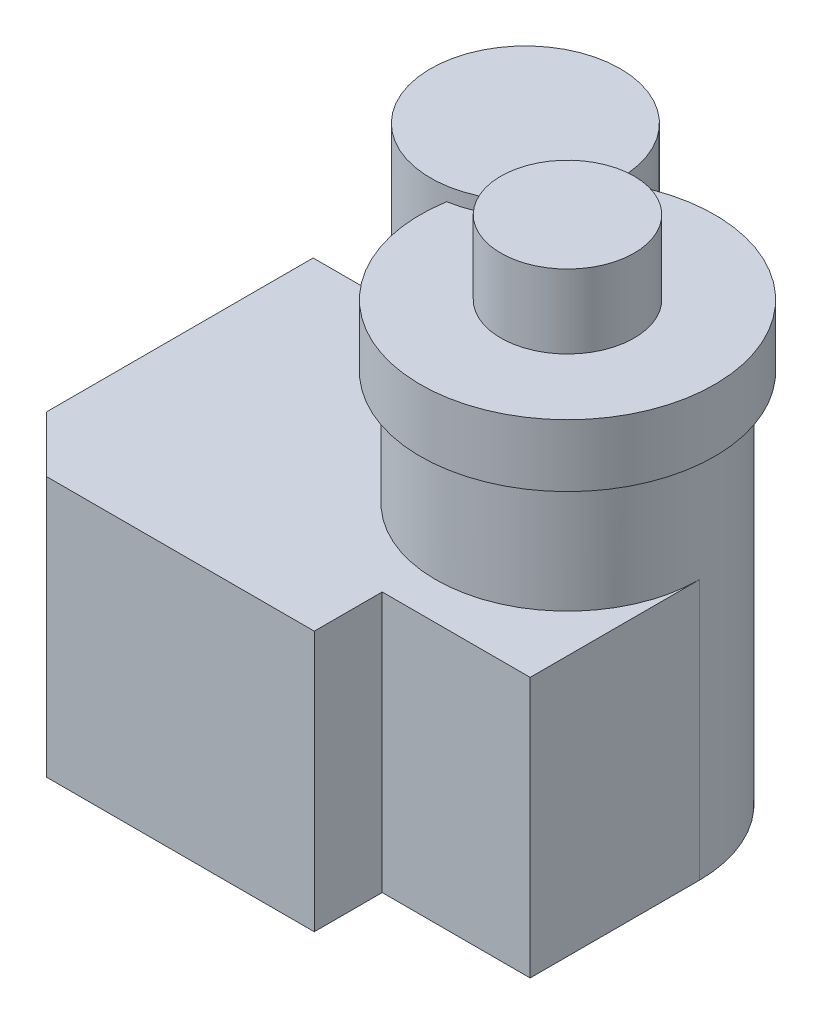
ISO-10303-21;
HEADER;
FILE_DESCRIPTION(('STEP AP214'),'2;1');
FILE_NAME('part.step','',(''),(''),'','','');
FILE_SCHEMA(('AUTOMOTIVE_DESIGN { 1 0 10303 214 1 1 1 1 }'));
ENDSEC;
DATA;
#1=APPLICATION_CONTEXT('core data for automotive mechanical design processes');
#2=APPLICATION_PROTOCOL_DEFINITION('international standard','automotive_design',2000,#1);
#3=PRODUCT_CONTEXT('',#1,'mechanical');
#4=PRODUCT('Part','Part','',(#3));
#5=PRODUCT_RELATED_PRODUCT_CATEGORY('part','',(#4));
#6=PRODUCT_DEFINITION_FORMATION('','',#4);
#7=PRODUCT_DEFINITION_CONTEXT('part definition',#1,'design');
#8=PRODUCT_DEFINITION('design','',#6,#7);
#9=PRODUCT_DEFINITION_SHAPE('','',#8);
#10=(LENGTH_UNIT() NAMED_UNIT(*) SI_UNIT(.MILLI.,.METRE.));
#11=(NAMED_UNIT(*) PLANE_ANGLE_UNIT() SI_UNIT($,.RADIAN.));
#12=(NAMED_UNIT(*) SI_UNIT($,.STERADIAN.) SOLID_ANGLE_UNIT());
#13=UNCERTAINTY_MEASURE_WITH_UNIT(LENGTH_MEASURE(1.E-05),#10,'distance_accuracy_value','');
#14=(GEOMETRIC_REPRESENTATION_CONTEXT(3) GLOBAL_UNCERTAINTY_ASSIGNED_CONTEXT((#13)) GLOBAL_UNIT_ASSIGNED_CONTEXT((#10,
#11,#12)) REPRESENTATION_CONTEXT('',''));
#15=CARTESIAN_POINT('',(0.,0.,0.));
#16=DIRECTION('',(0.,0.,1.));
#17=DIRECTION('',(1.,0.,0.));
#18=AXIS2_PLACEMENT_3D('',#15,#16,#17);
#19=CARTESIAN_POINT('',(0.,33.5999999999997,0.));
#20=DIRECTION('',(0.,1.,0.));
#21=DIRECTION('',(0.,0.,1.));
#22=AXIS2_PLACEMENT_3D('',#19,#20,#21);
#23=CONICAL_SURFACE('',#22,0.0140065580305215,0.61176630077576);
#24=CARTESIAN_POINT('',(0.,33.5800348749994,0.));
#25=VERTEX_POINT('',#24);
#26=VERTEX_LOOP('',#25);
#27=FACE_BOUND('',#26,.T.);
#28=CARTESIAN_POINT('',(0.,33.5999999999999,0.));
#29=DIRECTION('',(0.,1.,0.));
#30=DIRECTION('',(0.,0.,1.));
#31=AXIS2_PLACEMENT_3D('',#28,#29,#30);
#32=CIRCLE('',#31,0.0140065580305994);
#33=CARTESIAN_POINT('',(0.,33.5999999999999,0.0140065580305994));
#34=VERTEX_POINT('',#33);
#35=EDGE_CURVE('E19',#34,#34,#32,.F.);
#36=ORIENTED_EDGE('',*,*,#35,.F.);
#37=EDGE_LOOP('',(#36));
#38=FACE_BOUND('',#37,.T.);
#39=ADVANCED_FACE('F16',(#27,#38),#23,.F.);
#40=CARTESIAN_POINT('',(0.,33.6,0.));
#41=DIRECTION('',(0.,1.,0.));
#42=DIRECTION('',(0.,0.,1.));
#43=AXIS2_PLACEMENT_3D('',#40,#41,#42);
#44=PLANE('',#43);
#45=ORIENTED_EDGE('',*,*,#35,.T.);
#46=EDGE_LOOP('',(#45));
#47=FACE_BOUND('',#46,.T.);
#48=CARTESIAN_POINT('',(0.,33.6,0.));
#49=DIRECTION('',(0.,-1.,0.));
#50=DIRECTION('',(0.,0.,-1.));
#51=AXIS2_PLACEMENT_3D('',#48,#49,#50);
#52=CIRCLE('',#51,5.89);
#53=CARTESIAN_POINT('',(0.,33.6,-5.89));
#54=VERTEX_POINT('',#53);
#55=EDGE_CURVE('E103',#54,#54,#52,.T.);
#56=ORIENTED_EDGE('',*,*,#55,.F.);
#57=EDGE_LOOP('',(#56));
#58=FACE_BOUND('',#57,.T.);
#59=ADVANCED_FACE('F99',(#47,#58),#44,.T.);
#60=CARTESIAN_POINT('',(0.,33.6,0.));
#61=DIRECTION('',(0.,-1.,0.));
#62=DIRECTION('',(0.,0.,-1.));
#63=AXIS2_PLACEMENT_3D('',#60,#61,#62);
#64=CYLINDRICAL_SURFACE('',#63,5.89);
#65=CARTESIAN_POINT('',(0.,27.1,0.));
#66=DIRECTION('',(0.,-1.,0.));
#67=DIRECTION('',(0.,0.,-1.));
#68=AXIS2_PLACEMENT_3D('',#65,#66,#67);
#69=CIRCLE('',#68,5.89);
#70=CARTESIAN_POINT('',(0.,27.1,-5.89));
#71=VERTEX_POINT('',#70);
#72=EDGE_CURVE('E112',#71,#71,#69,.T.);
#73=ORIENTED_EDGE('',*,*,#72,.F.);
#74=EDGE_LOOP('',(#73));
#75=FACE_BOUND('',#74,.T.);
#76=ORIENTED_EDGE('',*,*,#55,.T.);
#77=EDGE_LOOP('',(#76));
#78=FACE_BOUND('',#77,.T.);
#79=ADVANCED_FACE('F450',(#75,#78),#64,.T.);
#80=CARTESIAN_POINT('',(-51.7786558204881,21.6,4.66472217329458));
#81=DIRECTION('',(0.,1.,0.));
#82=DIRECTION('',(0.,0.,1.));
#83=AXIS2_PLACEMENT_3D('',#80,#81,#82);
#84=PLANE('',#83);
#85=CARTESIAN_POINT('',(-14.145,21.6,-10.425));
#86=DIRECTION('',(0.,-1.,0.));
#87=DIRECTION('',(0.,0.,-1.));
#88=AXIS2_PLACEMENT_3D('',#85,#86,#87);
#89=CIRCLE('',#88,8.375);
#90=CARTESIAN_POINT('',(-11.3737933056841,21.6,-2.52177037804297));
#91=VERTEX_POINT('',#90);
#92=CARTESIAN_POINT('',(-12.8200607682087,21.6,-2.15546790730815));
#93=VERTEX_POINT('',#92);
#94=EDGE_CURVE('E107',#91,#93,#89,.T.);
#95=ORIENTED_EDGE('',*,*,#94,.F.);
#96=CARTESIAN_POINT('',(0.,21.6,0.));
#97=DIRECTION('',(0.,-1.,0.));
#98=DIRECTION('',(0.,0.,-1.));
#99=AXIS2_PLACEMENT_3D('',#96,#97,#98);
#100=CIRCLE('',#99,11.65);
#101=CARTESIAN_POINT('',(-5.77564594988728,21.6,-10.1175300277069));
#102=VERTEX_POINT('',#101);
#103=EDGE_CURVE('E77',#102,#91,#100,.T.);
#104=ORIENTED_EDGE('',*,*,#103,.F.);
#105=CARTESIAN_POINT('',(-14.145,21.6,-10.425));
#106=DIRECTION('',(0.,-1.,0.));
#107=DIRECTION('',(0.,0.,-1.));
#108=AXIS2_PLACEMENT_3D('',#105,#106,#107);
#109=CIRCLE('',#108,8.375);
#110=CARTESIAN_POINT('',(-5.85388853419006,21.6,-11.6074109528903));
#111=VERTEX_POINT('',#110);
#112=EDGE_CURVE('E73',#111,#102,#109,.T.);
#113=ORIENTED_EDGE('',*,*,#112,.F.);
#114=CARTESIAN_POINT('',(0.,21.6,0.));
#115=DIRECTION('',(0.,-1.,0.));
#116=DIRECTION('',(0.,0.,-1.));
#117=AXIS2_PLACEMENT_3D('',#114,#115,#116);
#118=CIRCLE('',#117,13.);
#119=EDGE_CURVE('E117',#93,#111,#118,.F.);
#120=ORIENTED_EDGE('',*,*,#119,.F.);
#121=EDGE_LOOP('',(#95,#104,#113,#120));
#122=FACE_BOUND('',#121,.T.);
#123=ADVANCED_FACE('F441',(#122),#84,.F.);
#124=CARTESIAN_POINT('',(-51.7786558204881,27.1,4.66472217329458));
#125=DIRECTION('',(0.,1.,0.));
#126=DIRECTION('',(0.,0.,1.));
#127=AXIS2_PLACEMENT_3D('',#124,#125,#126);
#128=PLANE('',#127);
#129=ORIENTED_EDGE('',*,*,#72,.T.);
#130=EDGE_LOOP('',(#129));
#131=FACE_BOUND('',#130,.T.);
#132=CARTESIAN_POINT('',(-14.145,27.1,-10.425));
#133=DIRECTION('',(0.,-1.,0.));
#134=DIRECTION('',(0.,0.,-1.));
#135=AXIS2_PLACEMENT_3D('',#132,#133,#134);
#136=CIRCLE('',#135,8.375);
#137=CARTESIAN_POINT('',(-12.8200607682087,27.1,-2.15546790730815));
#138=VERTEX_POINT('',#137);
#139=CARTESIAN_POINT('',(-5.85388853419006,27.1,-11.6074109528903));
#140=VERTEX_POINT('',#139);
#141=EDGE_CURVE('E123',#138,#140,#136,.F.);
#142=ORIENTED_EDGE('',*,*,#141,.F.);
#143=CARTESIAN_POINT('',(0.,27.1,0.));
#144=DIRECTION('',(0.,-1.,0.));
#145=DIRECTION('',(0.,0.,-1.));
#146=AXIS2_PLACEMENT_3D('',#143,#144,#145);
#147=CIRCLE('',#146,13.);
#148=EDGE_CURVE('E115',#140,#138,#147,.T.);
#149=ORIENTED_EDGE('',*,*,#148,.F.);
#150=EDGE_LOOP('',(#142,#149));
#151=FACE_BOUND('',#150,.T.);
#152=ADVANCED_FACE('F432',(#131,#151),#128,.T.);
#153=CARTESIAN_POINT('',(0.,27.1,0.));
#154=DIRECTION('',(0.,-1.,0.));
#155=DIRECTION('',(0.,0.,-1.));
#156=AXIS2_PLACEMENT_3D('',#153,#154,#155);
#157=CYLINDRICAL_SURFACE('',#156,13.);
#158=ORIENTED_EDGE('',*,*,#119,.T.);
#159=DIRECTION('',(0.,-1.,0.));
#160=VECTOR('',#159,1.);
#161=CARTESIAN_POINT('',(-5.85388853419006,28.3,-11.6074109528903));
#162=LINE('',#161,#160);
#163=EDGE_CURVE('E126',#140,#111,#162,.T.);
#164=ORIENTED_EDGE('',*,*,#163,.F.);
#165=ORIENTED_EDGE('',*,*,#148,.T.);
#166=DIRECTION('',(0.,-1.,0.));
#167=VECTOR('',#166,1.);
#168=CARTESIAN_POINT('',(-12.8200607682087,28.3,-2.15546790730815));
#169=LINE('',#168,#167);
#170=EDGE_CURVE('E127',#93,#138,#169,.F.);
#171=ORIENTED_EDGE('',*,*,#170,.F.);
#172=EDGE_LOOP('',(#158,#164,#165,#171));
#173=FACE_BOUND('',#172,.T.);
#174=ADVANCED_FACE('F424',(#173),#157,.T.);
#175=CARTESIAN_POINT('',(0.,-11.4999999998417,0.));
#176=DIRECTION('',(0.,-1.,0.));
#177=DIRECTION('',(0.,0.,-1.));
#178=AXIS2_PLACEMENT_3D('',#175,#176,#177);
#179=CONICAL_SURFACE('',#178,0.0267168474294959,0.46653411473415);
#180=CARTESIAN_POINT('',(0.,-11.4469496857055,2.8421709430404E-11));
#181=VERTEX_POINT('',#180);
#182=VERTEX_LOOP('',#181);
#183=FACE_BOUND('',#182,.T.);
#184=CARTESIAN_POINT('',(0.,-11.5000000000123,0.));
#185=DIRECTION('',(0.,-1.,0.));
#186=DIRECTION('',(0.,0.,-1.));
#187=AXIS2_PLACEMENT_3D('',#184,#185,#186);
#188=CIRCLE('',#187,0.0267168475153772);
#189=CARTESIAN_POINT('',(0.,-11.5000000000123,-0.026716847515379));
#190=VERTEX_POINT('',#189);
#191=EDGE_CURVE('E131',#190,#190,#188,.T.);
#192=ORIENTED_EDGE('',*,*,#191,.T.);
#193=EDGE_LOOP('',(#192));
#194=FACE_BOUND('',#193,.T.);
#195=ADVANCED_FACE('F416',(#183,#194),#179,.F.);
#196=CARTESIAN_POINT('',(-30.02,11.5,4.66472217329458));
#197=DIRECTION('',(-1.,0.,0.));
#198=DIRECTION('',(0.,0.,1.));
#199=AXIS2_PLACEMENT_3D('',#196,#197,#198);
#200=PLANE('',#199);
#201=DIRECTION('',(0.,0.,1.));
#202=VECTOR('',#201,1.);
#203=CARTESIAN_POINT('',(-30.02,11.5,4.66472217329458));
#204=LINE('',#203,#202);
#205=CARTESIAN_POINT('',(-30.02,11.5,-7.55));
#206=VERTEX_POINT('',#205);
#207=CARTESIAN_POINT('',(-30.02,11.5,16.0002525316942));
#208=VERTEX_POINT('',#207);
#209=EDGE_CURVE('E184',#206,#208,#204,.T.);
#210=ORIENTED_EDGE('',*,*,#209,.F.);
#211=DIRECTION('',(0.,1.,0.));
#212=VECTOR('',#211,1.);
#213=CARTESIAN_POINT('',(-30.02,11.5,-7.55));
#214=LINE('',#213,#212);
#215=CARTESIAN_POINT('',(-30.02,-11.5,-7.55));
#216=VERTEX_POINT('',#215);
#217=EDGE_CURVE('E180',#216,#206,#214,.T.);
#218=ORIENTED_EDGE('',*,*,#217,.F.);
#219=DIRECTION('',(0.,0.,1.));
#220=VECTOR('',#219,1.);
#221=CARTESIAN_POINT('',(-30.02,-11.5,4.66472217329458));
#222=LINE('',#221,#220);
#223=CARTESIAN_POINT('',(-30.02,-11.5,16.0002525316942));
#224=VERTEX_POINT('',#223);
#225=EDGE_CURVE('E85',#216,#224,#222,.T.);
#226=ORIENTED_EDGE('',*,*,#225,.T.);
#227=DIRECTION('',(0.,1.,0.));
#228=VECTOR('',#227,1.);
#229=CARTESIAN_POINT('',(-30.02,11.5,16.0002525316941));
#230=LINE('',#229,#228);
#231=EDGE_CURVE('E119',#224,#208,#230,.T.);
#232=ORIENTED_EDGE('',*,*,#231,.T.);
#233=EDGE_LOOP('',(#210,#218,#226,#232));
#234=FACE_BOUND('',#233,.T.);
#235=ADVANCED_FACE('F284',(#234),#200,.T.);
#236=CARTESIAN_POINT('',(-46.5670930894438,11.5,-0.546840557749763));
#237=DIRECTION('',(0.707106781186551,0.,-0.707106781186544));
#238=DIRECTION('',(-0.707106781186544,0.,-0.707106781186551));
#239=AXIS2_PLACEMENT_3D('',#236,#237,#238);
#240=PLANE('',#239);
#241=DIRECTION('',(0.,1.,0.));
#242=VECTOR('',#241,1.);
#243=CARTESIAN_POINT('',(-25.0702525316942,11.5,20.95));
#244=LINE('',#243,#242);
#245=CARTESIAN_POINT('',(-25.0702525316942,11.5,20.95));
#246=VERTEX_POINT('',#245);
#247=CARTESIAN_POINT('',(-25.0702525316942,-11.5,20.95));
#248=VERTEX_POINT('',#247);
#249=EDGE_CURVE('E191',#246,#248,#244,.F.);
#250=ORIENTED_EDGE('',*,*,#249,.F.);
#251=DIRECTION('',(0.707106781186545,0.,0.70710678118655));
#252=VECTOR('',#251,1.);
#253=CARTESIAN_POINT('',(-30.02,11.5,16.0002525316941));
#254=LINE('',#253,#252);
#255=EDGE_CURVE('E187',#208,#246,#254,.T.);
#256=ORIENTED_EDGE('',*,*,#255,.F.);
#257=ORIENTED_EDGE('',*,*,#231,.F.);
#258=DIRECTION('',(0.707106781186545,0.,0.70710678118655));
#259=VECTOR('',#258,1.);
#260=CARTESIAN_POINT('',(-30.02,-11.5,16.0002525316941));
#261=LINE('',#260,#259);
#262=EDGE_CURVE('E156',#224,#248,#261,.T.);
#263=ORIENTED_EDGE('',*,*,#262,.T.);
#264=EDGE_LOOP('',(#250,#256,#257,#263));
#265=FACE_BOUND('',#264,.T.);
#266=ADVANCED_FACE('F293',(#265),#240,.F.);
#267=CARTESIAN_POINT('',(-51.7786558204881,11.5,20.95));
#268=DIRECTION('',(0.,0.,1.));
#269=DIRECTION('',(1.,0.,0.));
#270=AXIS2_PLACEMENT_3D('',#267,#268,#269);
#271=PLANE('',#270);
#272=DIRECTION('',(1.,0.,0.));
#273=VECTOR('',#272,1.);
#274=CARTESIAN_POINT('',(-51.7786558204881,11.5,20.95));
#275=LINE('',#274,#273);
#276=CARTESIAN_POINT('',(-1.41999999999999,11.5,20.95));
#277=VERTEX_POINT('',#276);
#278=EDGE_CURVE('E196',#246,#277,#275,.T.);
#279=ORIENTED_EDGE('',*,*,#278,.F.);
#280=ORIENTED_EDGE('',*,*,#249,.T.);
#281=DIRECTION('',(1.,0.,0.));
#282=VECTOR('',#281,1.);
#283=CARTESIAN_POINT('',(-51.7786558204881,-11.5,20.95));
#284=LINE('',#283,#282);
#285=CARTESIAN_POINT('',(-1.41999999999999,-11.5,20.95));
#286=VERTEX_POINT('',#285);
#287=EDGE_CURVE('E158',#248,#286,#284,.T.);
#288=ORIENTED_EDGE('',*,*,#287,.T.);
#289=DIRECTION('',(0.,1.,0.));
#290=VECTOR('',#289,1.);
#291=CARTESIAN_POINT('',(-1.41999999999999,11.5,20.95));
#292=LINE('',#291,#290);
#293=EDGE_CURVE('E201',#277,#286,#292,.F.);
#294=ORIENTED_EDGE('',*,*,#293,.F.);
#295=EDGE_LOOP('',(#279,#280,#288,#294));
#296=FACE_BOUND('',#295,.T.);
#297=ADVANCED_FACE('F295',(#296),#271,.T.);
#298=CARTESIAN_POINT('',(-1.41999999999999,11.5,4.66472217329457));
#299=DIRECTION('',(1.,0.,0.));
#300=DIRECTION('',(0.,0.,-1.));
#301=AXIS2_PLACEMENT_3D('',#298,#299,#300);
#302=PLANE('',#301);
#303=DIRECTION('',(0.,0.,1.));
#304=VECTOR('',#303,1.);
#305=CARTESIAN_POINT('',(-1.41999999999999,11.5,4.66472217329458));
#306=LINE('',#305,#304);
#307=CARTESIAN_POINT('',(-1.41999999999999,11.5,14.95));
#308=VERTEX_POINT('',#307);
#309=EDGE_CURVE('E206',#277,#308,#306,.F.);
#310=ORIENTED_EDGE('',*,*,#309,.F.);
#311=ORIENTED_EDGE('',*,*,#293,.T.);
#312=DIRECTION('',(0.,0.,1.));
#313=VECTOR('',#312,1.);
#314=CARTESIAN_POINT('',(-1.41999999999999,-11.5,4.66472217329458));
#315=LINE('',#314,#313);
#316=CARTESIAN_POINT('',(-1.41999999999999,-11.5,14.95));
#317=VERTEX_POINT('',#316);
#318=EDGE_CURVE('E163',#286,#317,#315,.F.);
#319=ORIENTED_EDGE('',*,*,#318,.T.);
#320=DIRECTION('',(0.,1.,0.));
#321=VECTOR('',#320,1.);
#322=CARTESIAN_POINT('',(-1.41999999999999,11.5,14.95));
#323=LINE('',#322,#321);
#324=EDGE_CURVE('E211',#308,#317,#323,.F.);
#325=ORIENTED_EDGE('',*,*,#324,.F.);
#326=EDGE_LOOP('',(#310,#311,#319,#325));
#327=FACE_BOUND('',#326,.T.);
#328=ADVANCED_FACE('F300',(#327),#302,.T.);
#329=CARTESIAN_POINT('',(-51.7786558204881,11.5,14.95));
#330=DIRECTION('',(0.,0.,1.));
#331=DIRECTION('',(1.,0.,0.));
#332=AXIS2_PLACEMENT_3D('',#329,#330,#331);
#333=PLANE('',#332);
#334=DIRECTION('',(1.,0.,0.));
#335=VECTOR('',#334,1.);
#336=CARTESIAN_POINT('',(-51.7786558204881,11.5,14.95));
#337=LINE('',#336,#335);
#338=CARTESIAN_POINT('',(11.65,11.5,14.95));
#339=VERTEX_POINT('',#338);
#340=EDGE_CURVE('E216',#308,#339,#337,.T.);
#341=ORIENTED_EDGE('',*,*,#340,.F.);
#342=ORIENTED_EDGE('',*,*,#324,.T.);
#343=DIRECTION('',(1.,0.,0.));
#344=VECTOR('',#343,1.);
#345=CARTESIAN_POINT('',(-51.7786558204881,-11.5,14.95));
#346=LINE('',#345,#344);
#347=CARTESIAN_POINT('',(11.65,-11.5,14.95));
#348=VERTEX_POINT('',#347);
#349=EDGE_CURVE('E168',#317,#348,#346,.T.);
#350=ORIENTED_EDGE('',*,*,#349,.T.);
#351=DIRECTION('',(0.,1.,0.));
#352=VECTOR('',#351,1.);
#353=CARTESIAN_POINT('',(11.65,11.5,14.95));
#354=LINE('',#353,#352);
#355=EDGE_CURVE('E221',#339,#348,#354,.F.);
#356=ORIENTED_EDGE('',*,*,#355,.F.);
#357=EDGE_LOOP('',(#341,#342,#350,#356));
#358=FACE_BOUND('',#357,.T.);
#359=ADVANCED_FACE('F301',(#358),#333,.T.);
#360=CARTESIAN_POINT('',(11.65,11.5,4.66472217329457));
#361=DIRECTION('',(1.,0.,0.));
#362=DIRECTION('',(0.,0.,-1.));
#363=AXIS2_PLACEMENT_3D('',#360,#361,#362);
#364=PLANE('',#363);
#365=DIRECTION('',(0.,0.,1.));
#366=VECTOR('',#365,1.);
#367=CARTESIAN_POINT('',(11.65,11.5,4.66472217329458));
#368=LINE('',#367,#366);
#369=CARTESIAN_POINT('',(11.65,11.5,0.));
#370=VERTEX_POINT('',#369);
#371=EDGE_CURVE('E140',#339,#370,#368,.F.);
#372=ORIENTED_EDGE('',*,*,#371,.F.);
#373=ORIENTED_EDGE('',*,*,#355,.T.);
#374=DIRECTION('',(0.,0.,1.));
#375=VECTOR('',#374,1.);
#376=CARTESIAN_POINT('',(11.65,-11.5,4.66472217329458));
#377=LINE('',#376,#375);
#378=CARTESIAN_POINT('',(11.65,-11.5,0.));
#379=VERTEX_POINT('',#378);
#380=EDGE_CURVE('E132',#348,#379,#377,.F.);
#381=ORIENTED_EDGE('',*,*,#380,.T.);
#382=DIRECTION('',(0.,-1.,0.));
#383=VECTOR('',#382,1.);
#384=CARTESIAN_POINT('',(11.65,21.6,0.));
#385=LINE('',#384,#383);
#386=EDGE_CURVE('E122',#370,#379,#385,.T.);
#387=ORIENTED_EDGE('',*,*,#386,.F.);
#388=EDGE_LOOP('',(#372,#373,#381,#387));
#389=FACE_BOUND('',#388,.T.);
#390=ADVANCED_FACE('F256',(#389),#364,.T.);
#391=CARTESIAN_POINT('',(0.,21.6,0.));
#392=DIRECTION('',(0.,-1.,0.));
#393=DIRECTION('',(0.,0.,-1.));
#394=AXIS2_PLACEMENT_3D('',#391,#392,#393);
#395=CYLINDRICAL_SURFACE('',#394,11.65);
#396=DIRECTION('',(0.,-1.,0.));
#397=VECTOR('',#396,1.);
#398=CARTESIAN_POINT('',(-11.3737933056841,28.3,-2.52177037804297));
#399=LINE('',#398,#397);
#400=CARTESIAN_POINT('',(-11.3737933056841,11.5,-2.52177037804297));
#401=VERTEX_POINT('',#400);
#402=EDGE_CURVE('E121',#401,#91,#399,.F.);
#403=ORIENTED_EDGE('',*,*,#402,.F.);
#404=CARTESIAN_POINT('',(0.,11.5,0.));
#405=DIRECTION('',(0.,-1.,0.));
#406=DIRECTION('',(0.,0.,-1.));
#407=AXIS2_PLACEMENT_3D('',#404,#405,#406);
#408=CIRCLE('',#407,11.65);
#409=EDGE_CURVE('E136',#370,#401,#408,.T.);
#410=ORIENTED_EDGE('',*,*,#409,.F.);
#411=ORIENTED_EDGE('',*,*,#386,.T.);
#412=CARTESIAN_POINT('',(0.,-11.5,0.));
#413=DIRECTION('',(0.,-1.,0.));
#414=DIRECTION('',(0.,0.,-1.));
#415=AXIS2_PLACEMENT_3D('',#412,#413,#414);
#416=CIRCLE('',#415,11.65);
#417=CARTESIAN_POINT('',(-5.77564594988728,-11.5,-10.1175300277069));
#418=VERTEX_POINT('',#417);
#419=EDGE_CURVE('E128',#379,#418,#416,.F.);
#420=ORIENTED_EDGE('',*,*,#419,.T.);
#421=DIRECTION('',(0.,-1.,0.));
#422=VECTOR('',#421,1.);
#423=CARTESIAN_POINT('',(-5.77564594988728,28.3,-10.1175300277069));
#424=LINE('',#423,#422);
#425=EDGE_CURVE('E151',#102,#418,#424,.T.);
#426=ORIENTED_EDGE('',*,*,#425,.F.);
#427=ORIENTED_EDGE('',*,*,#103,.T.);
#428=EDGE_LOOP('',(#403,#410,#411,#420,#426,#427));
#429=FACE_BOUND('',#428,.T.);
#430=ADVANCED_FACE('F291',(#429),#395,.T.);
#431=CARTESIAN_POINT('',(-51.7786558204881,28.3,4.66472217329458));
#432=DIRECTION('',(0.,1.,0.));
#433=DIRECTION('',(0.,0.,1.));
#434=AXIS2_PLACEMENT_3D('',#431,#432,#433);
#435=PLANE('',#434);
#436=CARTESIAN_POINT('',(-14.145,28.3,-10.425));
#437=DIRECTION('',(0.,-1.,0.));
#438=DIRECTION('',(0.,0.,-1.));
#439=AXIS2_PLACEMENT_3D('',#436,#437,#438);
#440=CIRCLE('',#439,8.375);
#441=CARTESIAN_POINT('',(-14.145,28.3,-18.8));
#442=VERTEX_POINT('',#441);
#443=EDGE_CURVE('E139',#442,#442,#440,.T.);
#444=ORIENTED_EDGE('',*,*,#443,.F.);
#445=EDGE_LOOP('',(#444));
#446=FACE_BOUND('',#445,.T.);
#447=ADVANCED_FACE('F328',(#446),#435,.T.);
#448=CARTESIAN_POINT('',(-51.7786558204881,-28.3,4.66472217329458));
#449=DIRECTION('',(0.,1.,0.));
#450=DIRECTION('',(0.,0.,1.));
#451=AXIS2_PLACEMENT_3D('',#448,#449,#450);
#452=PLANE('',#451);
#453=CARTESIAN_POINT('',(-14.145,-28.3,-10.425));
#454=DIRECTION('',(0.,-1.,0.));
#455=DIRECTION('',(0.,0.,-1.));
#456=AXIS2_PLACEMENT_3D('',#453,#454,#455);
#457=CIRCLE('',#456,8.375);
#458=CARTESIAN_POINT('',(-14.145,-28.3,-18.8));
#459=VERTEX_POINT('',#458);
#460=EDGE_CURVE('E143',#459,#459,#457,.F.);
#461=ORIENTED_EDGE('',*,*,#460,.F.);
#462=EDGE_LOOP('',(#461));
#463=FACE_BOUND('',#462,.T.);
#464=ADVANCED_FACE('F324',(#463),#452,.F.);
#465=CARTESIAN_POINT('',(-51.7786558204881,-11.5,4.66472217329458));
#466=DIRECTION('',(0.,1.,0.));
#467=DIRECTION('',(0.,0.,1.));
#468=AXIS2_PLACEMENT_3D('',#465,#466,#467);
#469=PLANE('',#468);
#470=ORIENTED_EDGE('',*,*,#191,.F.);
#471=EDGE_LOOP('',(#470));
#472=FACE_BOUND('',#471,.T.);
#473=CARTESIAN_POINT('',(-14.145,-11.5,-10.425));
#474=DIRECTION('',(0.,-1.,0.));
#475=DIRECTION('',(0.,0.,-1.));
#476=AXIS2_PLACEMENT_3D('',#473,#474,#475);
#477=CIRCLE('',#476,8.375);
#478=CARTESIAN_POINT('',(-22.0110663612761,-11.5,-7.55));
#479=VERTEX_POINT('',#478);
#480=EDGE_CURVE('E146',#418,#479,#477,.T.);
#481=ORIENTED_EDGE('',*,*,#480,.F.);
#482=ORIENTED_EDGE('',*,*,#419,.F.);
#483=ORIENTED_EDGE('',*,*,#380,.F.);
#484=ORIENTED_EDGE('',*,*,#349,.F.);
#485=ORIENTED_EDGE('',*,*,#318,.F.);
#486=ORIENTED_EDGE('',*,*,#287,.F.);
#487=ORIENTED_EDGE('',*,*,#262,.F.);
#488=ORIENTED_EDGE('',*,*,#225,.F.);
#489=DIRECTION('',(-1.,0.,0.));
#490=VECTOR('',#489,1.);
#491=CARTESIAN_POINT('',(-51.7786558204881,-11.5,-7.55));
#492=LINE('',#491,#490);
#493=EDGE_CURVE('E135',#479,#216,#492,.T.);
#494=ORIENTED_EDGE('',*,*,#493,.F.);
#495=EDGE_LOOP('',(#481,#482,#483,#484,#485,#486,#487,#488,#494));
#496=FACE_BOUND('',#495,.T.);
#497=ADVANCED_FACE('F282',(#472,#496),#469,.F.);
#498=CARTESIAN_POINT('',(-51.7786558204881,11.5,-7.55));
#499=DIRECTION('',(0.,0.,-1.));
#500=DIRECTION('',(-1.,0.,0.));
#501=AXIS2_PLACEMENT_3D('',#498,#499,#500);
#502=PLANE('',#501);
#503=DIRECTION('',(1.,0.,0.));
#504=VECTOR('',#503,1.);
#505=CARTESIAN_POINT('',(-51.7786558204881,11.5,-7.55));
#506=LINE('',#505,#504);
#507=CARTESIAN_POINT('',(-22.0110663612761,11.5,-7.54999999999999));
#508=VERTEX_POINT('',#507);
#509=EDGE_CURVE('E34',#508,#206,#506,.F.);
#510=ORIENTED_EDGE('',*,*,#509,.F.);
#511=DIRECTION('',(0.,-1.,0.));
#512=VECTOR('',#511,1.);
#513=CARTESIAN_POINT('',(-22.0110663612761,28.3,-7.54999999999999));
#514=LINE('',#513,#512);
#515=EDGE_CURVE('E25',#479,#508,#514,.F.);
#516=ORIENTED_EDGE('',*,*,#515,.F.);
#517=ORIENTED_EDGE('',*,*,#493,.T.);
#518=ORIENTED_EDGE('',*,*,#217,.T.);
#519=EDGE_LOOP('',(#510,#516,#517,#518));
#520=FACE_BOUND('',#519,.T.);
#521=ADVANCED_FACE('F285',(#520),#502,.T.);
#522=CARTESIAN_POINT('',(-51.7786558204881,11.5,4.66472217329458));
#523=DIRECTION('',(0.,1.,0.));
#524=DIRECTION('',(0.,0.,1.));
#525=AXIS2_PLACEMENT_3D('',#522,#523,#524);
#526=PLANE('',#525);
#527=ORIENTED_EDGE('',*,*,#409,.T.);
#528=CARTESIAN_POINT('',(-14.145,11.5,-10.425));
#529=DIRECTION('',(0.,-1.,0.));
#530=DIRECTION('',(0.,0.,-1.));
#531=AXIS2_PLACEMENT_3D('',#528,#529,#530);
#532=CIRCLE('',#531,8.375);
#533=EDGE_CURVE('E10',#508,#401,#532,.F.);
#534=ORIENTED_EDGE('',*,*,#533,.F.);
#535=ORIENTED_EDGE('',*,*,#509,.T.);
#536=ORIENTED_EDGE('',*,*,#209,.T.);
#537=ORIENTED_EDGE('',*,*,#255,.T.);
#538=ORIENTED_EDGE('',*,*,#278,.T.);
#539=ORIENTED_EDGE('',*,*,#309,.T.);
#540=ORIENTED_EDGE('',*,*,#340,.T.);
#541=ORIENTED_EDGE('',*,*,#371,.T.);
#542=EDGE_LOOP('',(#527,#534,#535,#536,#537,#538,#539,#540,#541));
#543=FACE_BOUND('',#542,.T.);
#544=ADVANCED_FACE('F252',(#543),#526,.T.);
#545=CARTESIAN_POINT('',(-14.145,28.3,-10.425));
#546=DIRECTION('',(0.,-1.,0.));
#547=DIRECTION('',(0.,0.,-1.));
#548=AXIS2_PLACEMENT_3D('',#545,#546,#547);
#549=CYLINDRICAL_SURFACE('',#548,8.375);
#550=ORIENTED_EDGE('',*,*,#443,.T.);
#551=EDGE_LOOP('',(#550));
#552=FACE_BOUND('',#551,.T.);
#553=ORIENTED_EDGE('',*,*,#460,.T.);
#554=EDGE_LOOP('',(#553));
#555=FACE_BOUND('',#554,.T.);
#556=ORIENTED_EDGE('',*,*,#515,.T.);
#557=ORIENTED_EDGE('',*,*,#533,.T.);
#558=ORIENTED_EDGE('',*,*,#402,.T.);
#559=ORIENTED_EDGE('',*,*,#94,.T.);
#560=ORIENTED_EDGE('',*,*,#170,.T.);
#561=ORIENTED_EDGE('',*,*,#141,.T.);
#562=ORIENTED_EDGE('',*,*,#163,.T.);
#563=ORIENTED_EDGE('',*,*,#112,.T.);
#564=ORIENTED_EDGE('',*,*,#425,.T.);
#565=ORIENTED_EDGE('',*,*,#480,.T.);
#566=EDGE_LOOP('',(#556,#557,#558,#559,#560,#561,#562,#563,#564,#565));
#567=FACE_BOUND('',#566,.T.);
#568=ADVANCED_FACE('F287',(#552,#555,#567),#549,.T.);
#569=CLOSED_SHELL('',(#39,#59,#79,#123,#152,#174,#195,#235,#266,#297,#328,#359,#390,#430,#447,
#464,#497,#521,#544,#568));
#570=MANIFOLD_SOLID_BREP('B1',#569);
#571=ADVANCED_BREP_SHAPE_REPRESENTATION('',(#18,#570),#14);
#572=SHAPE_DEFINITION_REPRESENTATION(#9,#571);
ENDSEC;
END-ISO-10303-21;
